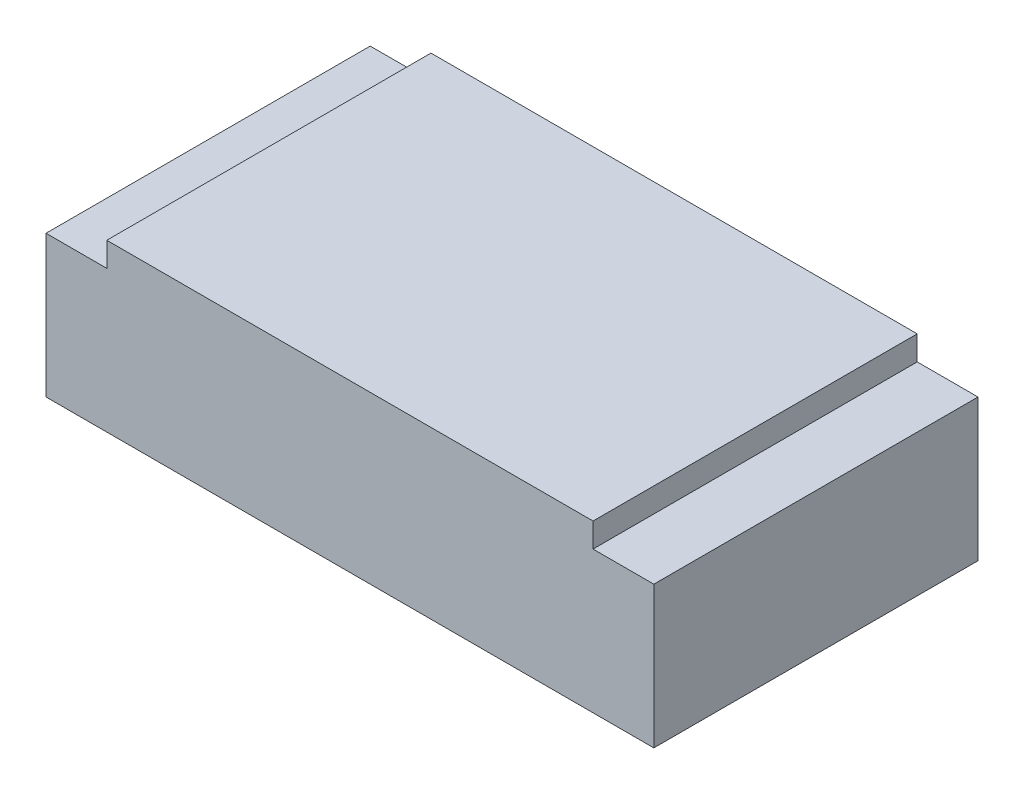
ISO-10303-21;
HEADER;
FILE_DESCRIPTION(('STEP AP214'),'2;1');
FILE_NAME('part.step','',(''),(''),'','','');
FILE_SCHEMA(('AUTOMOTIVE_DESIGN { 1 0 10303 214 1 1 1 1 }'));
ENDSEC;
DATA;
#1=APPLICATION_CONTEXT('core data for automotive mechanical design processes');
#2=APPLICATION_PROTOCOL_DEFINITION('international standard','automotive_design',2000,#1);
#3=PRODUCT_CONTEXT('',#1,'mechanical');
#4=PRODUCT('Part','Part','',(#3));
#5=PRODUCT_RELATED_PRODUCT_CATEGORY('part','',(#4));
#6=PRODUCT_DEFINITION_FORMATION('','',#4);
#7=PRODUCT_DEFINITION_CONTEXT('part definition',#1,'design');
#8=PRODUCT_DEFINITION('design','',#6,#7);
#9=PRODUCT_DEFINITION_SHAPE('','',#8);
#10=(LENGTH_UNIT() NAMED_UNIT(*) SI_UNIT(.MILLI.,.METRE.));
#11=(NAMED_UNIT(*) PLANE_ANGLE_UNIT() SI_UNIT($,.RADIAN.));
#12=(NAMED_UNIT(*) SI_UNIT($,.STERADIAN.) SOLID_ANGLE_UNIT());
#13=UNCERTAINTY_MEASURE_WITH_UNIT(LENGTH_MEASURE(1.E-05),#10,'distance_accuracy_value','');
#14=(GEOMETRIC_REPRESENTATION_CONTEXT(3) GLOBAL_UNCERTAINTY_ASSIGNED_CONTEXT((#13)) GLOBAL_UNIT_ASSIGNED_CONTEXT((#10,
#11,#12)) REPRESENTATION_CONTEXT('',''));
#15=CARTESIAN_POINT('',(0.,0.,0.));
#16=DIRECTION('',(0.,0.,1.));
#17=DIRECTION('',(1.,0.,0.));
#18=AXIS2_PLACEMENT_3D('',#15,#16,#17);
#19=CARTESIAN_POINT('',(0.6,0.205,-0.4));
#20=DIRECTION('',(1.,0.,0.));
#21=DIRECTION('',(0.,0.,-1.));
#22=AXIS2_PLACEMENT_3D('',#19,#20,#21);
#23=PLANE('',#22);
#24=DIRECTION('',(0.,-1.,0.));
#25=VECTOR('',#24,1.);
#26=CARTESIAN_POINT('',(0.6,0.02528795811518,-0.4));
#27=LINE('',#26,#25);
#28=CARTESIAN_POINT('',(0.6,0.175,-0.4));
#29=VERTEX_POINT('',#28);
#30=CARTESIAN_POINT('',(0.6,0.235,-0.4));
#31=VERTEX_POINT('',#30);
#32=EDGE_CURVE('E118',#29,#31,#27,.F.);
#33=ORIENTED_EDGE('',*,*,#32,.T.);
#34=DIRECTION('',(0.,0.,1.));
#35=VECTOR('',#34,1.);
#36=CARTESIAN_POINT('',(0.6,0.235,-0.4));
#37=LINE('',#36,#35);
#38=CARTESIAN_POINT('',(0.6,0.235,0.4));
#39=VERTEX_POINT('',#38);
#40=EDGE_CURVE('E20',#39,#31,#37,.F.);
#41=ORIENTED_EDGE('',*,*,#40,.F.);
#42=DIRECTION('',(0.,-1.,0.));
#43=VECTOR('',#42,1.);
#44=CARTESIAN_POINT('',(0.6,0.02528795811518,0.4));
#45=LINE('',#44,#43);
#46=CARTESIAN_POINT('',(0.6,0.175,0.4));
#47=VERTEX_POINT('',#46);
#48=EDGE_CURVE('E94',#47,#39,#45,.F.);
#49=ORIENTED_EDGE('',*,*,#48,.F.);
#50=DIRECTION('',(0.,0.,1.));
#51=VECTOR('',#50,1.);
#52=CARTESIAN_POINT('',(0.6,0.175,-0.4));
#53=LINE('',#52,#51);
#54=EDGE_CURVE('E83',#29,#47,#53,.T.);
#55=ORIENTED_EDGE('',*,*,#54,.F.);
#56=EDGE_LOOP('',(#33,#41,#49,#55));
#57=FACE_BOUND('',#56,.T.);
#58=ADVANCED_FACE('F17',(#57),#23,.T.);
#59=CARTESIAN_POINT('',(0.,0.235,-0.4));
#60=DIRECTION('',(0.,1.,0.));
#61=DIRECTION('',(-1.,0.,0.));
#62=AXIS2_PLACEMENT_3D('',#59,#60,#61);
#63=PLANE('',#62);
#64=DIRECTION('',(1.,0.,0.));
#65=VECTOR('',#64,1.);
#66=CARTESIAN_POINT('',(0.,0.235,-0.4));
#67=LINE('',#66,#65);
#68=CARTESIAN_POINT('',(-0.6,0.235,-0.4));
#69=VERTEX_POINT('',#68);
#70=EDGE_CURVE('E116',#31,#69,#67,.F.);
#71=ORIENTED_EDGE('',*,*,#70,.T.);
#72=DIRECTION('',(0.,0.,1.));
#73=VECTOR('',#72,1.);
#74=CARTESIAN_POINT('',(-0.6,0.235,-0.4));
#75=LINE('',#74,#73);
#76=CARTESIAN_POINT('',(-0.6,0.235,0.4));
#77=VERTEX_POINT('',#76);
#78=EDGE_CURVE('E108',#77,#69,#75,.F.);
#79=ORIENTED_EDGE('',*,*,#78,.F.);
#80=DIRECTION('',(1.,0.,0.));
#81=VECTOR('',#80,1.);
#82=CARTESIAN_POINT('',(0.,0.235,0.4));
#83=LINE('',#82,#81);
#84=EDGE_CURVE('E97',#39,#77,#83,.F.);
#85=ORIENTED_EDGE('',*,*,#84,.F.);
#86=ORIENTED_EDGE('',*,*,#40,.T.);
#87=EDGE_LOOP('',(#71,#79,#85,#86));
#88=FACE_BOUND('',#87,.T.);
#89=ADVANCED_FACE('F115',(#88),#63,.T.);
#90=CARTESIAN_POINT('',(-0.6,0.205,-0.4));
#91=DIRECTION('',(-1.,0.,0.));
#92=DIRECTION('',(0.,0.,1.));
#93=AXIS2_PLACEMENT_3D('',#90,#91,#92);
#94=PLANE('',#93);
#95=DIRECTION('',(0.,-1.,0.));
#96=VECTOR('',#95,1.);
#97=CARTESIAN_POINT('',(-0.6,0.02528795811518,-0.4));
#98=LINE('',#97,#96);
#99=CARTESIAN_POINT('',(-0.6,0.175,-0.4));
#100=VERTEX_POINT('',#99);
#101=EDGE_CURVE('E120',#69,#100,#98,.T.);
#102=ORIENTED_EDGE('',*,*,#101,.T.);
#103=DIRECTION('',(0.,0.,1.));
#104=VECTOR('',#103,1.);
#105=CARTESIAN_POINT('',(-0.6,0.175,-0.4));
#106=LINE('',#105,#104);
#107=CARTESIAN_POINT('',(-0.6,0.175,0.4));
#108=VERTEX_POINT('',#107);
#109=EDGE_CURVE('E91',#108,#100,#106,.F.);
#110=ORIENTED_EDGE('',*,*,#109,.F.);
#111=DIRECTION('',(0.,-1.,0.));
#112=VECTOR('',#111,1.);
#113=CARTESIAN_POINT('',(-0.6,0.02528795811518,0.4));
#114=LINE('',#113,#112);
#115=EDGE_CURVE('E135',#77,#108,#114,.T.);
#116=ORIENTED_EDGE('',*,*,#115,.F.);
#117=ORIENTED_EDGE('',*,*,#78,.T.);
#118=EDGE_LOOP('',(#102,#110,#116,#117));
#119=FACE_BOUND('',#118,.T.);
#120=ADVANCED_FACE('F138',(#119),#94,.T.);
#121=CARTESIAN_POINT('',(-0.675,0.175,-0.4));
#122=DIRECTION('',(0.,1.,0.));
#123=DIRECTION('',(-1.,0.,0.));
#124=AXIS2_PLACEMENT_3D('',#121,#122,#123);
#125=PLANE('',#124);
#126=DIRECTION('',(1.,0.,0.));
#127=VECTOR('',#126,1.);
#128=CARTESIAN_POINT('',(0.,0.175,-0.4));
#129=LINE('',#128,#127);
#130=CARTESIAN_POINT('',(-0.75,0.175,-0.4));
#131=VERTEX_POINT('',#130);
#132=EDGE_CURVE('E122',#100,#131,#129,.F.);
#133=ORIENTED_EDGE('',*,*,#132,.T.);
#134=DIRECTION('',(0.,0.,1.));
#135=VECTOR('',#134,1.);
#136=CARTESIAN_POINT('',(-0.75,0.175,-0.4));
#137=LINE('',#136,#135);
#138=CARTESIAN_POINT('',(-0.75,0.175,0.4));
#139=VERTEX_POINT('',#138);
#140=EDGE_CURVE('E124',#139,#131,#137,.F.);
#141=ORIENTED_EDGE('',*,*,#140,.F.);
#142=DIRECTION('',(1.,0.,0.));
#143=VECTOR('',#142,1.);
#144=CARTESIAN_POINT('',(0.,0.175,0.4));
#145=LINE('',#144,#143);
#146=EDGE_CURVE('E133',#108,#139,#145,.F.);
#147=ORIENTED_EDGE('',*,*,#146,.F.);
#148=ORIENTED_EDGE('',*,*,#109,.T.);
#149=EDGE_LOOP('',(#133,#141,#147,#148));
#150=FACE_BOUND('',#149,.T.);
#151=ADVANCED_FACE('F140',(#150),#125,.T.);
#152=CARTESIAN_POINT('',(0.675,0.175,-0.4));
#153=DIRECTION('',(0.,1.,0.));
#154=DIRECTION('',(-1.,0.,0.));
#155=AXIS2_PLACEMENT_3D('',#152,#153,#154);
#156=PLANE('',#155);
#157=DIRECTION('',(1.,0.,0.));
#158=VECTOR('',#157,1.);
#159=CARTESIAN_POINT('',(0.,0.175,-0.4));
#160=LINE('',#159,#158);
#161=CARTESIAN_POINT('',(0.75,0.175,-0.4));
#162=VERTEX_POINT('',#161);
#163=EDGE_CURVE('E89',#162,#29,#160,.F.);
#164=ORIENTED_EDGE('',*,*,#163,.T.);
#165=ORIENTED_EDGE('',*,*,#54,.T.);
#166=DIRECTION('',(1.,0.,0.));
#167=VECTOR('',#166,1.);
#168=CARTESIAN_POINT('',(0.,0.175,0.4));
#169=LINE('',#168,#167);
#170=CARTESIAN_POINT('',(0.75,0.175,0.4));
#171=VERTEX_POINT('',#170);
#172=EDGE_CURVE('E87',#171,#47,#169,.F.);
#173=ORIENTED_EDGE('',*,*,#172,.F.);
#174=DIRECTION('',(0.,0.,-1.));
#175=VECTOR('',#174,1.);
#176=CARTESIAN_POINT('',(0.75,0.175,-0.4));
#177=LINE('',#176,#175);
#178=EDGE_CURVE('E150',#162,#171,#177,.F.);
#179=ORIENTED_EDGE('',*,*,#178,.F.);
#180=EDGE_LOOP('',(#164,#165,#173,#179));
#181=FACE_BOUND('',#180,.T.);
#182=ADVANCED_FACE('F84',(#181),#156,.T.);
#183=CARTESIAN_POINT('',(0.,0.02528795811518,0.4));
#184=DIRECTION('',(0.,0.,1.));
#185=DIRECTION('',(0.,-1.,0.));
#186=AXIS2_PLACEMENT_3D('',#183,#184,#185);
#187=PLANE('',#186);
#188=ORIENTED_EDGE('',*,*,#115,.T.);
#189=ORIENTED_EDGE('',*,*,#146,.T.);
#190=DIRECTION('',(0.,1.,0.));
#191=VECTOR('',#190,1.);
#192=CARTESIAN_POINT('',(-0.75,0.,0.4));
#193=LINE('',#192,#191);
#194=CARTESIAN_POINT('',(-0.75,-0.175,0.4));
#195=VERTEX_POINT('',#194);
#196=EDGE_CURVE('E130',#195,#139,#193,.T.);
#197=ORIENTED_EDGE('',*,*,#196,.F.);
#198=DIRECTION('',(1.,0.,0.));
#199=VECTOR('',#198,1.);
#200=CARTESIAN_POINT('',(0.,-0.175,0.4));
#201=LINE('',#200,#199);
#202=CARTESIAN_POINT('',(0.75,-0.175,0.4));
#203=VERTEX_POINT('',#202);
#204=EDGE_CURVE('E148',#203,#195,#201,.F.);
#205=ORIENTED_EDGE('',*,*,#204,.F.);
#206=DIRECTION('',(0.,1.,0.));
#207=VECTOR('',#206,1.);
#208=CARTESIAN_POINT('',(0.75,0.,0.4));
#209=LINE('',#208,#207);
#210=EDGE_CURVE('E102',#171,#203,#209,.F.);
#211=ORIENTED_EDGE('',*,*,#210,.F.);
#212=ORIENTED_EDGE('',*,*,#172,.T.);
#213=ORIENTED_EDGE('',*,*,#48,.T.);
#214=ORIENTED_EDGE('',*,*,#84,.T.);
#215=EDGE_LOOP('',(#188,#189,#197,#205,#211,#212,#213,#214));
#216=FACE_BOUND('',#215,.T.);
#217=ADVANCED_FACE('F100',(#216),#187,.T.);
#218=CARTESIAN_POINT('',(-0.75,0.,-0.4));
#219=DIRECTION('',(-1.,0.,0.));
#220=DIRECTION('',(0.,0.,1.));
#221=AXIS2_PLACEMENT_3D('',#218,#219,#220);
#222=PLANE('',#221);
#223=DIRECTION('',(0.,-1.,0.));
#224=VECTOR('',#223,1.);
#225=CARTESIAN_POINT('',(-0.75,0.02528795811518,-0.4));
#226=LINE('',#225,#224);
#227=CARTESIAN_POINT('',(-0.75,-0.175,-0.4));
#228=VERTEX_POINT('',#227);
#229=EDGE_CURVE('E163',#131,#228,#226,.T.);
#230=ORIENTED_EDGE('',*,*,#229,.T.);
#231=DIRECTION('',(0.,0.,1.));
#232=VECTOR('',#231,1.);
#233=CARTESIAN_POINT('',(-0.75,-0.175,-0.4));
#234=LINE('',#233,#232);
#235=EDGE_CURVE('E146',#195,#228,#234,.F.);
#236=ORIENTED_EDGE('',*,*,#235,.F.);
#237=ORIENTED_EDGE('',*,*,#196,.T.);
#238=ORIENTED_EDGE('',*,*,#140,.T.);
#239=EDGE_LOOP('',(#230,#236,#237,#238));
#240=FACE_BOUND('',#239,.T.);
#241=ADVANCED_FACE('F144',(#240),#222,.T.);
#242=CARTESIAN_POINT('',(0.,0.02528795811518,-0.4));
#243=DIRECTION('',(0.,0.,1.));
#244=DIRECTION('',(0.,-1.,0.));
#245=AXIS2_PLACEMENT_3D('',#242,#243,#244);
#246=PLANE('',#245);
#247=DIRECTION('',(0.,1.,0.));
#248=VECTOR('',#247,1.);
#249=CARTESIAN_POINT('',(0.75,0.,-0.4));
#250=LINE('',#249,#248);
#251=CARTESIAN_POINT('',(0.75,-0.175,-0.4));
#252=VERTEX_POINT('',#251);
#253=EDGE_CURVE('E35',#252,#162,#250,.T.);
#254=ORIENTED_EDGE('',*,*,#253,.F.);
#255=DIRECTION('',(1.,0.,0.));
#256=VECTOR('',#255,1.);
#257=CARTESIAN_POINT('',(0.,-0.175,-0.4));
#258=LINE('',#257,#256);
#259=EDGE_CURVE('E26',#228,#252,#258,.T.);
#260=ORIENTED_EDGE('',*,*,#259,.F.);
#261=ORIENTED_EDGE('',*,*,#229,.F.);
#262=ORIENTED_EDGE('',*,*,#132,.F.);
#263=ORIENTED_EDGE('',*,*,#101,.F.);
#264=ORIENTED_EDGE('',*,*,#70,.F.);
#265=ORIENTED_EDGE('',*,*,#32,.F.);
#266=ORIENTED_EDGE('',*,*,#163,.F.);
#267=EDGE_LOOP('',(#254,#260,#261,#262,#263,#264,#265,#266));
#268=FACE_BOUND('',#267,.T.);
#269=ADVANCED_FACE('F117',(#268),#246,.F.);
#270=CARTESIAN_POINT('',(0.75,0.,-0.4));
#271=DIRECTION('',(1.,0.,0.));
#272=DIRECTION('',(0.,0.,-1.));
#273=AXIS2_PLACEMENT_3D('',#270,#271,#272);
#274=PLANE('',#273);
#275=ORIENTED_EDGE('',*,*,#253,.T.);
#276=ORIENTED_EDGE('',*,*,#178,.T.);
#277=ORIENTED_EDGE('',*,*,#210,.T.);
#278=DIRECTION('',(0.,0.,1.));
#279=VECTOR('',#278,1.);
#280=CARTESIAN_POINT('',(0.75,-0.175,-0.4));
#281=LINE('',#280,#279);
#282=EDGE_CURVE('E11',#252,#203,#281,.T.);
#283=ORIENTED_EDGE('',*,*,#282,.F.);
#284=EDGE_LOOP('',(#275,#276,#277,#283));
#285=FACE_BOUND('',#284,.T.);
#286=ADVANCED_FACE('F153',(#285),#274,.T.);
#287=CARTESIAN_POINT('',(0.,-0.175,-0.4));
#288=DIRECTION('',(0.,-1.,0.));
#289=DIRECTION('',(1.,0.,0.));
#290=AXIS2_PLACEMENT_3D('',#287,#288,#289);
#291=PLANE('',#290);
#292=ORIENTED_EDGE('',*,*,#259,.T.);
#293=ORIENTED_EDGE('',*,*,#282,.T.);
#294=ORIENTED_EDGE('',*,*,#204,.T.);
#295=ORIENTED_EDGE('',*,*,#235,.T.);
#296=EDGE_LOOP('',(#292,#293,#294,#295));
#297=FACE_BOUND('',#296,.T.);
#298=ADVANCED_FACE('F156',(#297),#291,.T.);
#299=CLOSED_SHELL('',(#58,#89,#120,#151,#182,#217,#241,#269,#286,#298));
#300=MANIFOLD_SOLID_BREP('B1',#299);
#301=ADVANCED_BREP_SHAPE_REPRESENTATION('',(#18,#300),#14);
#302=SHAPE_DEFINITION_REPRESENTATION(#9,#301);
ENDSEC;
END-ISO-10303-21;
